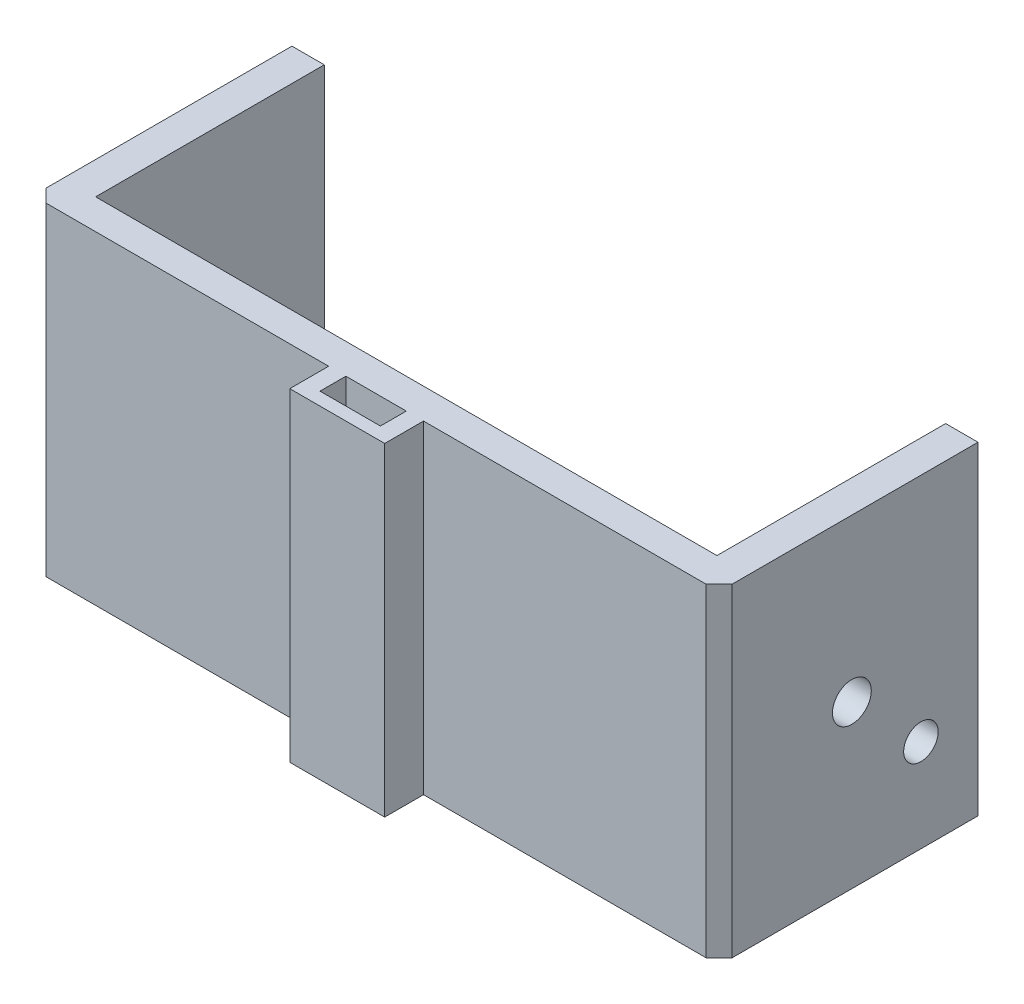
ISO-10303-21;
HEADER;
FILE_DESCRIPTION(('STEP AP214'),'2;1');
FILE_NAME('part.step','',(''),(''),'','','');
FILE_SCHEMA(('AUTOMOTIVE_DESIGN { 1 0 10303 214 1 1 1 1 }'));
ENDSEC;
DATA;
#1=APPLICATION_CONTEXT('core data for automotive mechanical design processes');
#2=APPLICATION_PROTOCOL_DEFINITION('international standard','automotive_design',2000,#1);
#3=PRODUCT_CONTEXT('',#1,'mechanical');
#4=PRODUCT('Part','Part','',(#3));
#5=PRODUCT_RELATED_PRODUCT_CATEGORY('part','',(#4));
#6=PRODUCT_DEFINITION_FORMATION('','',#4);
#7=PRODUCT_DEFINITION_CONTEXT('part definition',#1,'design');
#8=PRODUCT_DEFINITION('design','',#6,#7);
#9=PRODUCT_DEFINITION_SHAPE('','',#8);
#10=(LENGTH_UNIT() NAMED_UNIT(*) SI_UNIT(.MILLI.,.METRE.));
#11=(NAMED_UNIT(*) PLANE_ANGLE_UNIT() SI_UNIT($,.RADIAN.));
#12=(NAMED_UNIT(*) SI_UNIT($,.STERADIAN.) SOLID_ANGLE_UNIT());
#13=UNCERTAINTY_MEASURE_WITH_UNIT(LENGTH_MEASURE(1.E-05),#10,'distance_accuracy_value','');
#14=(GEOMETRIC_REPRESENTATION_CONTEXT(3) GLOBAL_UNCERTAINTY_ASSIGNED_CONTEXT((#13)) GLOBAL_UNIT_ASSIGNED_CONTEXT((#10,
#11,#12)) REPRESENTATION_CONTEXT('',''));
#15=CARTESIAN_POINT('',(0.,0.,0.));
#16=DIRECTION('',(0.,0.,1.));
#17=DIRECTION('',(1.,0.,0.));
#18=AXIS2_PLACEMENT_3D('',#15,#16,#17);
#19=CARTESIAN_POINT('',(0.,75.,0.));
#20=DIRECTION('',(0.,1.,0.));
#21=DIRECTION('',(0.,0.,1.));
#22=AXIS2_PLACEMENT_3D('',#19,#20,#21);
#23=PLANE('',#22);
#24=DIRECTION('',(-1.,0.,0.));
#25=VECTOR('',#24,1.);
#26=CARTESIAN_POINT('',(-72.,75.,3.00000000000002));
#27=LINE('',#26,#25);
#28=CARTESIAN_POINT('',(72.,75.,3.));
#29=VERTEX_POINT('',#28);
#30=CARTESIAN_POINT('',(-72.,75.,3.00000000000002));
#31=VERTEX_POINT('',#30);
#32=EDGE_CURVE('E309',#29,#31,#27,.T.);
#33=ORIENTED_EDGE('',*,*,#32,.T.);
#34=DIRECTION('',(0.,0.,-1.));
#35=VECTOR('',#34,1.);
#36=CARTESIAN_POINT('',(-72.,75.,0.));
#37=LINE('',#36,#35);
#38=CARTESIAN_POINT('',(-72.,75.,-50.));
#39=VERTEX_POINT('',#38);
#40=EDGE_CURVE('E221',#31,#39,#37,.T.);
#41=ORIENTED_EDGE('',*,*,#40,.T.);
#42=DIRECTION('',(-1.,0.,0.));
#43=VECTOR('',#42,1.);
#44=CARTESIAN_POINT('',(-72.,75.,-50.));
#45=LINE('',#44,#43);
#46=CARTESIAN_POINT('',(-79.5,75.,-50.));
#47=VERTEX_POINT('',#46);
#48=EDGE_CURVE('E224',#39,#47,#45,.T.);
#49=ORIENTED_EDGE('',*,*,#48,.T.);
#50=DIRECTION('',(0.,0.,1.));
#51=VECTOR('',#50,1.);
#52=CARTESIAN_POINT('',(-79.5,75.,-50.));
#53=LINE('',#52,#51);
#54=CARTESIAN_POINT('',(-79.5,75.,6.99999999999998));
#55=VERTEX_POINT('',#54);
#56=EDGE_CURVE('E227',#47,#55,#53,.T.);
#57=ORIENTED_EDGE('',*,*,#56,.T.);
#58=DIRECTION('',(-0.707106781186548,0.,-0.707106781186548));
#59=VECTOR('',#58,1.);
#60=CARTESIAN_POINT('',(-43.25,75.,43.25));
#61=LINE('',#60,#59);
#62=CARTESIAN_POINT('',(-76.4999999999999,75.,10.));
#63=VERTEX_POINT('',#62);
#64=EDGE_CURVE('E307',#55,#63,#61,.F.);
#65=ORIENTED_EDGE('',*,*,#64,.T.);
#66=DIRECTION('',(1.,0.,0.));
#67=VECTOR('',#66,1.);
#68=CARTESIAN_POINT('',(-11.,75.,10.));
#69=LINE('',#68,#67);
#70=CARTESIAN_POINT('',(-11.,75.,10.));
#71=VERTEX_POINT('',#70);
#72=EDGE_CURVE('E230',#63,#71,#69,.T.);
#73=ORIENTED_EDGE('',*,*,#72,.T.);
#74=DIRECTION('',(0.,0.,1.));
#75=VECTOR('',#74,1.);
#76=CARTESIAN_POINT('',(-11.,75.,10.));
#77=LINE('',#76,#75);
#78=CARTESIAN_POINT('',(-11.,75.,19.));
#79=VERTEX_POINT('',#78);
#80=EDGE_CURVE('E232',#71,#79,#77,.T.);
#81=ORIENTED_EDGE('',*,*,#80,.T.);
#82=DIRECTION('',(1.,0.,0.));
#83=VECTOR('',#82,1.);
#84=CARTESIAN_POINT('',(11.,75.,19.));
#85=LINE('',#84,#83);
#86=CARTESIAN_POINT('',(11.,75.,19.));
#87=VERTEX_POINT('',#86);
#88=EDGE_CURVE('E234',#79,#87,#85,.T.);
#89=ORIENTED_EDGE('',*,*,#88,.T.);
#90=DIRECTION('',(0.,0.,-1.));
#91=VECTOR('',#90,1.);
#92=CARTESIAN_POINT('',(11.,75.,10.));
#93=LINE('',#92,#91);
#94=CARTESIAN_POINT('',(11.,75.,10.));
#95=VERTEX_POINT('',#94);
#96=EDGE_CURVE('E236',#87,#95,#93,.T.);
#97=ORIENTED_EDGE('',*,*,#96,.T.);
#98=DIRECTION('',(1.,0.,0.));
#99=VECTOR('',#98,1.);
#100=CARTESIAN_POINT('',(79.5,75.,10.));
#101=LINE('',#100,#99);
#102=CARTESIAN_POINT('',(76.5,75.,10.));
#103=VERTEX_POINT('',#102);
#104=EDGE_CURVE('E238',#95,#103,#101,.T.);
#105=ORIENTED_EDGE('',*,*,#104,.T.);
#106=DIRECTION('',(-0.707106781186547,0.,0.707106781186548));
#107=VECTOR('',#106,1.);
#108=CARTESIAN_POINT('',(43.25,75.,43.25));
#109=LINE('',#108,#107);
#110=CARTESIAN_POINT('',(79.5,75.,6.99999999999999));
#111=VERTEX_POINT('',#110);
#112=EDGE_CURVE('E300',#103,#111,#109,.F.);
#113=ORIENTED_EDGE('',*,*,#112,.T.);
#114=DIRECTION('',(0.,0.,-1.));
#115=VECTOR('',#114,1.);
#116=CARTESIAN_POINT('',(79.5,75.,-50.));
#117=LINE('',#116,#115);
#118=CARTESIAN_POINT('',(79.5,75.,-50.));
#119=VERTEX_POINT('',#118);
#120=EDGE_CURVE('E241',#111,#119,#117,.T.);
#121=ORIENTED_EDGE('',*,*,#120,.T.);
#122=DIRECTION('',(-1.,0.,0.));
#123=VECTOR('',#122,1.);
#124=CARTESIAN_POINT('',(72.,75.,-50.));
#125=LINE('',#124,#123);
#126=CARTESIAN_POINT('',(72.,75.,-50.));
#127=VERTEX_POINT('',#126);
#128=EDGE_CURVE('E243',#119,#127,#125,.T.);
#129=ORIENTED_EDGE('',*,*,#128,.T.);
#130=DIRECTION('',(0.,0.,1.));
#131=VECTOR('',#130,1.);
#132=CARTESIAN_POINT('',(72.,75.,0.));
#133=LINE('',#132,#131);
#134=EDGE_CURVE('E245',#127,#29,#133,.T.);
#135=ORIENTED_EDGE('',*,*,#134,.T.);
#136=EDGE_LOOP('',(#33,#41,#49,#57,#65,#73,#81,#89,#97,#105,#113,#121,#129,#135));
#137=FACE_BOUND('',#136,.T.);
#138=DIRECTION('',(0.,0.,1.));
#139=VECTOR('',#138,1.);
#140=CARTESIAN_POINT('',(-7.,75.,10.));
#141=LINE('',#140,#139);
#142=CARTESIAN_POINT('',(-7.,75.,10.));
#143=VERTEX_POINT('',#142);
#144=CARTESIAN_POINT('',(-7.,75.,16.));
#145=VERTEX_POINT('',#144);
#146=EDGE_CURVE('E188',#143,#145,#141,.T.);
#147=ORIENTED_EDGE('',*,*,#146,.F.);
#148=DIRECTION('',(-1.,0.,0.));
#149=VECTOR('',#148,1.);
#150=CARTESIAN_POINT('',(7.,75.,10.));
#151=LINE('',#150,#149);
#152=CARTESIAN_POINT('',(7.,75.,10.));
#153=VERTEX_POINT('',#152);
#154=EDGE_CURVE('E178',#153,#143,#151,.T.);
#155=ORIENTED_EDGE('',*,*,#154,.F.);
#156=DIRECTION('',(0.,0.,-1.));
#157=VECTOR('',#156,1.);
#158=CARTESIAN_POINT('',(7.,75.,10.));
#159=LINE('',#158,#157);
#160=CARTESIAN_POINT('',(7.,75.,16.));
#161=VERTEX_POINT('',#160);
#162=EDGE_CURVE('E203',#161,#153,#159,.T.);
#163=ORIENTED_EDGE('',*,*,#162,.F.);
#164=DIRECTION('',(1.,0.,0.));
#165=VECTOR('',#164,1.);
#166=CARTESIAN_POINT('',(7.,75.,16.));
#167=LINE('',#166,#165);
#168=EDGE_CURVE('E201',#145,#161,#167,.T.);
#169=ORIENTED_EDGE('',*,*,#168,.F.);
#170=EDGE_LOOP('',(#147,#155,#163,#169));
#171=FACE_BOUND('',#170,.T.);
#172=ADVANCED_FACE('F43',(#137,#171),#23,.T.);
#173=CARTESIAN_POINT('',(0.,0.,0.));
#174=DIRECTION('',(0.,1.,0.));
#175=DIRECTION('',(0.,0.,1.));
#176=AXIS2_PLACEMENT_3D('',#173,#174,#175);
#177=PLANE('',#176);
#178=DIRECTION('',(1.,0.,0.));
#179=VECTOR('',#178,1.);
#180=CARTESIAN_POINT('',(-11.,0.,10.));
#181=LINE('',#180,#179);
#182=CARTESIAN_POINT('',(-76.4999999999999,0.,10.));
#183=VERTEX_POINT('',#182);
#184=CARTESIAN_POINT('',(-11.,0.,10.));
#185=VERTEX_POINT('',#184);
#186=EDGE_CURVE('E254',#183,#185,#181,.T.);
#187=ORIENTED_EDGE('',*,*,#186,.F.);
#188=DIRECTION('',(0.707106781186548,0.,0.707106781186548));
#189=VECTOR('',#188,1.);
#190=CARTESIAN_POINT('',(-76.4999999999999,0.,10.));
#191=LINE('',#190,#189);
#192=CARTESIAN_POINT('',(-79.5,0.,6.99999999999998));
#193=VERTEX_POINT('',#192);
#194=EDGE_CURVE('E60',#183,#193,#191,.F.);
#195=ORIENTED_EDGE('',*,*,#194,.T.);
#196=DIRECTION('',(0.,0.,1.));
#197=VECTOR('',#196,1.);
#198=CARTESIAN_POINT('',(-79.5,0.,-50.));
#199=LINE('',#198,#197);
#200=CARTESIAN_POINT('',(-79.5,0.,-50.));
#201=VERTEX_POINT('',#200);
#202=EDGE_CURVE('E252',#201,#193,#199,.T.);
#203=ORIENTED_EDGE('',*,*,#202,.F.);
#204=DIRECTION('',(-1.,0.,0.));
#205=VECTOR('',#204,1.);
#206=CARTESIAN_POINT('',(-72.,0.,-50.));
#207=LINE('',#206,#205);
#208=CARTESIAN_POINT('',(-72.,0.,-50.));
#209=VERTEX_POINT('',#208);
#210=EDGE_CURVE('E250',#209,#201,#207,.T.);
#211=ORIENTED_EDGE('',*,*,#210,.F.);
#212=DIRECTION('',(0.,0.,-1.));
#213=VECTOR('',#212,1.);
#214=CARTESIAN_POINT('',(-72.,0.,0.));
#215=LINE('',#214,#213);
#216=CARTESIAN_POINT('',(-72.,0.,0.));
#217=VERTEX_POINT('',#216);
#218=EDGE_CURVE('E196',#217,#209,#215,.T.);
#219=ORIENTED_EDGE('',*,*,#218,.F.);
#220=DIRECTION('',(-1.,0.,0.));
#221=VECTOR('',#220,1.);
#222=CARTESIAN_POINT('',(72.,0.,0.));
#223=LINE('',#222,#221);
#224=CARTESIAN_POINT('',(72.,0.,0.));
#225=VERTEX_POINT('',#224);
#226=EDGE_CURVE('E225',#225,#217,#223,.T.);
#227=ORIENTED_EDGE('',*,*,#226,.F.);
#228=DIRECTION('',(0.,0.,1.));
#229=VECTOR('',#228,1.);
#230=CARTESIAN_POINT('',(72.,0.,0.));
#231=LINE('',#230,#229);
#232=CARTESIAN_POINT('',(72.,0.,-50.));
#233=VERTEX_POINT('',#232);
#234=EDGE_CURVE('E268',#233,#225,#231,.T.);
#235=ORIENTED_EDGE('',*,*,#234,.F.);
#236=DIRECTION('',(-1.,0.,0.));
#237=VECTOR('',#236,1.);
#238=CARTESIAN_POINT('',(72.,0.,-50.));
#239=LINE('',#238,#237);
#240=CARTESIAN_POINT('',(79.5,0.,-50.));
#241=VERTEX_POINT('',#240);
#242=EDGE_CURVE('E266',#241,#233,#239,.T.);
#243=ORIENTED_EDGE('',*,*,#242,.F.);
#244=DIRECTION('',(0.,0.,-1.));
#245=VECTOR('',#244,1.);
#246=CARTESIAN_POINT('',(79.5,0.,-50.));
#247=LINE('',#246,#245);
#248=CARTESIAN_POINT('',(79.5,0.,6.99999999999999));
#249=VERTEX_POINT('',#248);
#250=EDGE_CURVE('E264',#249,#241,#247,.T.);
#251=ORIENTED_EDGE('',*,*,#250,.F.);
#252=DIRECTION('',(0.707106781186547,0.,-0.707106781186548));
#253=VECTOR('',#252,1.);
#254=CARTESIAN_POINT('',(79.5,0.,7.));
#255=LINE('',#254,#253);
#256=CARTESIAN_POINT('',(76.5,0.,10.));
#257=VERTEX_POINT('',#256);
#258=EDGE_CURVE('E67',#249,#257,#255,.F.);
#259=ORIENTED_EDGE('',*,*,#258,.T.);
#260=DIRECTION('',(1.,0.,0.));
#261=VECTOR('',#260,1.);
#262=CARTESIAN_POINT('',(79.5,0.,10.));
#263=LINE('',#262,#261);
#264=CARTESIAN_POINT('',(11.,0.,10.));
#265=VERTEX_POINT('',#264);
#266=EDGE_CURVE('E262',#265,#257,#263,.T.);
#267=ORIENTED_EDGE('',*,*,#266,.F.);
#268=DIRECTION('',(0.,0.,-1.));
#269=VECTOR('',#268,1.);
#270=CARTESIAN_POINT('',(11.,0.,10.));
#271=LINE('',#270,#269);
#272=CARTESIAN_POINT('',(11.,0.,19.));
#273=VERTEX_POINT('',#272);
#274=EDGE_CURVE('E260',#273,#265,#271,.T.);
#275=ORIENTED_EDGE('',*,*,#274,.F.);
#276=DIRECTION('',(1.,0.,0.));
#277=VECTOR('',#276,1.);
#278=CARTESIAN_POINT('',(11.,0.,19.));
#279=LINE('',#278,#277);
#280=CARTESIAN_POINT('',(-11.,0.,19.));
#281=VERTEX_POINT('',#280);
#282=EDGE_CURVE('E258',#281,#273,#279,.T.);
#283=ORIENTED_EDGE('',*,*,#282,.F.);
#284=DIRECTION('',(0.,0.,1.));
#285=VECTOR('',#284,1.);
#286=CARTESIAN_POINT('',(-11.,0.,10.));
#287=LINE('',#286,#285);
#288=EDGE_CURVE('E256',#185,#281,#287,.T.);
#289=ORIENTED_EDGE('',*,*,#288,.F.);
#290=EDGE_LOOP('',(#187,#195,#203,#211,#219,#227,#235,#243,#251,#259,#267,#275,#283,#289));
#291=FACE_BOUND('',#290,.T.);
#292=DIRECTION('',(-1.,0.,0.));
#293=VECTOR('',#292,1.);
#294=CARTESIAN_POINT('',(7.,0.,10.));
#295=LINE('',#294,#293);
#296=CARTESIAN_POINT('',(7.,0.,10.));
#297=VERTEX_POINT('',#296);
#298=CARTESIAN_POINT('',(-7.,0.,10.));
#299=VERTEX_POINT('',#298);
#300=EDGE_CURVE('E208',#297,#299,#295,.T.);
#301=ORIENTED_EDGE('',*,*,#300,.T.);
#302=DIRECTION('',(0.,0.,1.));
#303=VECTOR('',#302,1.);
#304=CARTESIAN_POINT('',(-7.,0.,10.));
#305=LINE('',#304,#303);
#306=CARTESIAN_POINT('',(-7.,0.,16.));
#307=VERTEX_POINT('',#306);
#308=EDGE_CURVE('E195',#299,#307,#305,.T.);
#309=ORIENTED_EDGE('',*,*,#308,.T.);
#310=DIRECTION('',(1.,0.,0.));
#311=VECTOR('',#310,1.);
#312=CARTESIAN_POINT('',(7.,0.,16.));
#313=LINE('',#312,#311);
#314=CARTESIAN_POINT('',(7.,0.,16.));
#315=VERTEX_POINT('',#314);
#316=EDGE_CURVE('E212',#307,#315,#313,.T.);
#317=ORIENTED_EDGE('',*,*,#316,.T.);
#318=DIRECTION('',(0.,0.,-1.));
#319=VECTOR('',#318,1.);
#320=CARTESIAN_POINT('',(7.,0.,10.));
#321=LINE('',#320,#319);
#322=EDGE_CURVE('E189',#315,#297,#321,.T.);
#323=ORIENTED_EDGE('',*,*,#322,.T.);
#324=EDGE_LOOP('',(#301,#309,#317,#323));
#325=FACE_BOUND('',#324,.T.);
#326=ADVANCED_FACE('F347',(#291,#325),#177,.F.);
#327=CARTESIAN_POINT('',(-72.,75.,0.));
#328=DIRECTION('',(-1.,0.,0.));
#329=DIRECTION('',(0.,0.,1.));
#330=AXIS2_PLACEMENT_3D('',#327,#328,#329);
#331=PLANE('',#330);
#332=CARTESIAN_POINT('',(-72.,21.5,-36.7700000000001));
#333=DIRECTION('',(-1.,0.,0.));
#334=DIRECTION('',(0.,0.,1.));
#335=AXIS2_PLACEMENT_3D('',#332,#333,#334);
#336=CIRCLE('',#335,4.00000000000001);
#337=CARTESIAN_POINT('',(-72.,21.5,-32.7700000000001));
#338=VERTEX_POINT('',#337);
#339=EDGE_CURVE('E584',#338,#338,#336,.T.);
#340=ORIENTED_EDGE('',*,*,#339,.T.);
#341=EDGE_LOOP('',(#340));
#342=FACE_BOUND('',#341,.T.);
#343=CARTESIAN_POINT('',(-72.,37.5,-20.77));
#344=DIRECTION('',(-1.,0.,0.));
#345=DIRECTION('',(0.,0.,1.));
#346=AXIS2_PLACEMENT_3D('',#343,#344,#345);
#347=CIRCLE('',#346,4.5);
#348=CARTESIAN_POINT('',(-72.,37.5,-16.27));
#349=VERTEX_POINT('',#348);
#350=EDGE_CURVE('E304',#349,#349,#347,.T.);
#351=ORIENTED_EDGE('',*,*,#350,.T.);
#352=EDGE_LOOP('',(#351));
#353=FACE_BOUND('',#352,.T.);
#354=ORIENTED_EDGE('',*,*,#218,.T.);
#355=DIRECTION('',(0.,-1.,0.));
#356=VECTOR('',#355,1.);
#357=CARTESIAN_POINT('',(-72.,75.,-50.));
#358=LINE('',#357,#356);
#359=EDGE_CURVE('E297',#39,#209,#358,.T.);
#360=ORIENTED_EDGE('',*,*,#359,.F.);
#361=ORIENTED_EDGE('',*,*,#40,.F.);
#362=DIRECTION('',(0.,-0.707106781186548,-0.707106781186548));
#363=VECTOR('',#362,1.);
#364=CARTESIAN_POINT('',(-72.,73.5,1.50000000000002));
#365=LINE('',#364,#363);
#366=CARTESIAN_POINT('',(-72.,72.,0.));
#367=VERTEX_POINT('',#366);
#368=EDGE_CURVE('E53',#31,#367,#365,.T.);
#369=ORIENTED_EDGE('',*,*,#368,.T.);
#370=DIRECTION('',(0.,-1.,0.));
#371=VECTOR('',#370,1.);
#372=CARTESIAN_POINT('',(-72.,75.,0.));
#373=LINE('',#372,#371);
#374=EDGE_CURVE('E247',#367,#217,#373,.T.);
#375=ORIENTED_EDGE('',*,*,#374,.T.);
#376=EDGE_LOOP('',(#354,#360,#361,#369,#375));
#377=FACE_BOUND('',#376,.T.);
#378=ADVANCED_FACE('F329',(#342,#353,#377),#331,.F.);
#379=CARTESIAN_POINT('',(-72.,75.,-50.));
#380=DIRECTION('',(0.,0.,1.));
#381=DIRECTION('',(1.,0.,0.));
#382=AXIS2_PLACEMENT_3D('',#379,#380,#381);
#383=PLANE('',#382);
#384=ORIENTED_EDGE('',*,*,#210,.T.);
#385=DIRECTION('',(0.,-1.,0.));
#386=VECTOR('',#385,1.);
#387=CARTESIAN_POINT('',(-79.5,75.,-50.));
#388=LINE('',#387,#386);
#389=EDGE_CURVE('E294',#47,#201,#388,.T.);
#390=ORIENTED_EDGE('',*,*,#389,.F.);
#391=ORIENTED_EDGE('',*,*,#48,.F.);
#392=ORIENTED_EDGE('',*,*,#359,.T.);
#393=EDGE_LOOP('',(#384,#390,#391,#392));
#394=FACE_BOUND('',#393,.T.);
#395=ADVANCED_FACE('F350',(#394),#383,.F.);
#396=CARTESIAN_POINT('',(-79.5,75.,-50.));
#397=DIRECTION('',(1.,0.,0.));
#398=DIRECTION('',(0.,0.,-1.));
#399=AXIS2_PLACEMENT_3D('',#396,#397,#398);
#400=PLANE('',#399);
#401=CARTESIAN_POINT('',(-79.5,21.5,-36.7700000000001));
#402=DIRECTION('',(1.,0.,0.));
#403=DIRECTION('',(0.,0.,-1.));
#404=AXIS2_PLACEMENT_3D('',#401,#402,#403);
#405=CIRCLE('',#404,4.00000000000001);
#406=CARTESIAN_POINT('',(-79.5,21.5,-40.7700000000001));
#407=VERTEX_POINT('',#406);
#408=EDGE_CURVE('E581',#407,#407,#405,.T.);
#409=ORIENTED_EDGE('',*,*,#408,.T.);
#410=EDGE_LOOP('',(#409));
#411=FACE_BOUND('',#410,.T.);
#412=CARTESIAN_POINT('',(-79.5,37.5,-20.77));
#413=DIRECTION('',(1.,0.,0.));
#414=DIRECTION('',(0.,0.,-1.));
#415=AXIS2_PLACEMENT_3D('',#412,#413,#414);
#416=CIRCLE('',#415,4.5);
#417=CARTESIAN_POINT('',(-79.5,37.5,-25.27));
#418=VERTEX_POINT('',#417);
#419=EDGE_CURVE('E305',#418,#418,#416,.T.);
#420=ORIENTED_EDGE('',*,*,#419,.T.);
#421=EDGE_LOOP('',(#420));
#422=FACE_BOUND('',#421,.T.);
#423=ORIENTED_EDGE('',*,*,#202,.T.);
#424=DIRECTION('',(0.,1.,0.));
#425=VECTOR('',#424,1.);
#426=CARTESIAN_POINT('',(-79.5,75.,6.99999999999999));
#427=LINE('',#426,#425);
#428=EDGE_CURVE('E319',#193,#55,#427,.T.);
#429=ORIENTED_EDGE('',*,*,#428,.T.);
#430=ORIENTED_EDGE('',*,*,#56,.F.);
#431=ORIENTED_EDGE('',*,*,#389,.T.);
#432=EDGE_LOOP('',(#423,#429,#430,#431));
#433=FACE_BOUND('',#432,.T.);
#434=ADVANCED_FACE('F393',(#411,#422,#433),#400,.F.);
#435=CARTESIAN_POINT('',(-11.,75.,10.));
#436=DIRECTION('',(0.,0.,-1.));
#437=DIRECTION('',(-1.,0.,0.));
#438=AXIS2_PLACEMENT_3D('',#435,#436,#437);
#439=PLANE('',#438);
#440=ORIENTED_EDGE('',*,*,#72,.F.);
#441=DIRECTION('',(0.,-1.,0.));
#442=VECTOR('',#441,1.);
#443=CARTESIAN_POINT('',(-76.4999999999999,75.,10.));
#444=LINE('',#443,#442);
#445=EDGE_CURVE('E314',#63,#183,#444,.T.);
#446=ORIENTED_EDGE('',*,*,#445,.T.);
#447=ORIENTED_EDGE('',*,*,#186,.T.);
#448=DIRECTION('',(0.,-1.,0.));
#449=VECTOR('',#448,1.);
#450=CARTESIAN_POINT('',(-11.,75.,10.));
#451=LINE('',#450,#449);
#452=EDGE_CURVE('E291',#71,#185,#451,.T.);
#453=ORIENTED_EDGE('',*,*,#452,.F.);
#454=EDGE_LOOP('',(#440,#446,#447,#453));
#455=FACE_BOUND('',#454,.T.);
#456=ADVANCED_FACE('F386',(#455),#439,.F.);
#457=CARTESIAN_POINT('',(-11.,75.,10.));
#458=DIRECTION('',(1.,0.,0.));
#459=DIRECTION('',(0.,0.,-1.));
#460=AXIS2_PLACEMENT_3D('',#457,#458,#459);
#461=PLANE('',#460);
#462=ORIENTED_EDGE('',*,*,#288,.T.);
#463=DIRECTION('',(0.,-1.,0.));
#464=VECTOR('',#463,1.);
#465=CARTESIAN_POINT('',(-11.,75.,19.));
#466=LINE('',#465,#464);
#467=EDGE_CURVE('E288',#79,#281,#466,.T.);
#468=ORIENTED_EDGE('',*,*,#467,.F.);
#469=ORIENTED_EDGE('',*,*,#80,.F.);
#470=ORIENTED_EDGE('',*,*,#452,.T.);
#471=EDGE_LOOP('',(#462,#468,#469,#470));
#472=FACE_BOUND('',#471,.T.);
#473=ADVANCED_FACE('F382',(#472),#461,.F.);
#474=CARTESIAN_POINT('',(11.,75.,19.));
#475=DIRECTION('',(0.,0.,-1.));
#476=DIRECTION('',(-1.,0.,0.));
#477=AXIS2_PLACEMENT_3D('',#474,#475,#476);
#478=PLANE('',#477);
#479=ORIENTED_EDGE('',*,*,#282,.T.);
#480=DIRECTION('',(0.,-1.,0.));
#481=VECTOR('',#480,1.);
#482=CARTESIAN_POINT('',(11.,75.,19.));
#483=LINE('',#482,#481);
#484=EDGE_CURVE('E285',#87,#273,#483,.T.);
#485=ORIENTED_EDGE('',*,*,#484,.F.);
#486=ORIENTED_EDGE('',*,*,#88,.F.);
#487=ORIENTED_EDGE('',*,*,#467,.T.);
#488=EDGE_LOOP('',(#479,#485,#486,#487));
#489=FACE_BOUND('',#488,.T.);
#490=ADVANCED_FACE('F378',(#489),#478,.F.);
#491=CARTESIAN_POINT('',(11.,75.,10.));
#492=DIRECTION('',(-1.,0.,0.));
#493=DIRECTION('',(0.,0.,1.));
#494=AXIS2_PLACEMENT_3D('',#491,#492,#493);
#495=PLANE('',#494);
#496=ORIENTED_EDGE('',*,*,#274,.T.);
#497=DIRECTION('',(0.,-1.,0.));
#498=VECTOR('',#497,1.);
#499=CARTESIAN_POINT('',(11.,75.,10.));
#500=LINE('',#499,#498);
#501=EDGE_CURVE('E282',#95,#265,#500,.T.);
#502=ORIENTED_EDGE('',*,*,#501,.F.);
#503=ORIENTED_EDGE('',*,*,#96,.F.);
#504=ORIENTED_EDGE('',*,*,#484,.T.);
#505=EDGE_LOOP('',(#496,#502,#503,#504));
#506=FACE_BOUND('',#505,.T.);
#507=ADVANCED_FACE('F373',(#506),#495,.F.);
#508=CARTESIAN_POINT('',(79.5,75.,10.));
#509=DIRECTION('',(0.,0.,-1.));
#510=DIRECTION('',(-1.,0.,0.));
#511=AXIS2_PLACEMENT_3D('',#508,#509,#510);
#512=PLANE('',#511);
#513=ORIENTED_EDGE('',*,*,#266,.T.);
#514=DIRECTION('',(0.,1.,0.));
#515=VECTOR('',#514,1.);
#516=CARTESIAN_POINT('',(76.5,75.,10.));
#517=LINE('',#516,#515);
#518=EDGE_CURVE('E324',#257,#103,#517,.T.);
#519=ORIENTED_EDGE('',*,*,#518,.T.);
#520=ORIENTED_EDGE('',*,*,#104,.F.);
#521=ORIENTED_EDGE('',*,*,#501,.T.);
#522=EDGE_LOOP('',(#513,#519,#520,#521));
#523=FACE_BOUND('',#522,.T.);
#524=ADVANCED_FACE('F367',(#523),#512,.F.);
#525=CARTESIAN_POINT('',(79.5,75.,-50.));
#526=DIRECTION('',(-1.,0.,0.));
#527=DIRECTION('',(0.,0.,1.));
#528=AXIS2_PLACEMENT_3D('',#525,#526,#527);
#529=PLANE('',#528);
#530=CARTESIAN_POINT('',(79.5,21.5,-36.7700000000001));
#531=DIRECTION('',(1.,0.,0.));
#532=DIRECTION('',(0.,0.,-1.));
#533=AXIS2_PLACEMENT_3D('',#530,#531,#532);
#534=CIRCLE('',#533,4.00000000000001);
#535=CARTESIAN_POINT('',(79.5,21.5,-40.7700000000001));
#536=VERTEX_POINT('',#535);
#537=EDGE_CURVE('E592',#536,#536,#534,.T.);
#538=ORIENTED_EDGE('',*,*,#537,.F.);
#539=EDGE_LOOP('',(#538));
#540=FACE_BOUND('',#539,.T.);
#541=CARTESIAN_POINT('',(79.5,37.5,-20.77));
#542=DIRECTION('',(1.,0.,0.));
#543=DIRECTION('',(0.,0.,-1.));
#544=AXIS2_PLACEMENT_3D('',#541,#542,#543);
#545=CIRCLE('',#544,4.5);
#546=CARTESIAN_POINT('',(79.5,37.5,-25.27));
#547=VERTEX_POINT('',#546);
#548=EDGE_CURVE('E586',#547,#547,#545,.T.);
#549=ORIENTED_EDGE('',*,*,#548,.F.);
#550=EDGE_LOOP('',(#549));
#551=FACE_BOUND('',#550,.T.);
#552=ORIENTED_EDGE('',*,*,#120,.F.);
#553=DIRECTION('',(0.,-1.,0.));
#554=VECTOR('',#553,1.);
#555=CARTESIAN_POINT('',(79.5,75.,7.));
#556=LINE('',#555,#554);
#557=EDGE_CURVE('E321',#111,#249,#556,.T.);
#558=ORIENTED_EDGE('',*,*,#557,.T.);
#559=ORIENTED_EDGE('',*,*,#250,.T.);
#560=DIRECTION('',(0.,-1.,0.));
#561=VECTOR('',#560,1.);
#562=CARTESIAN_POINT('',(79.5,75.,-50.));
#563=LINE('',#562,#561);
#564=EDGE_CURVE('E279',#119,#241,#563,.T.);
#565=ORIENTED_EDGE('',*,*,#564,.F.);
#566=EDGE_LOOP('',(#552,#558,#559,#565));
#567=FACE_BOUND('',#566,.T.);
#568=ADVANCED_FACE('F360',(#540,#551,#567),#529,.F.);
#569=CARTESIAN_POINT('',(72.,75.,-50.));
#570=DIRECTION('',(0.,0.,1.));
#571=DIRECTION('',(1.,0.,0.));
#572=AXIS2_PLACEMENT_3D('',#569,#570,#571);
#573=PLANE('',#572);
#574=ORIENTED_EDGE('',*,*,#242,.T.);
#575=DIRECTION('',(0.,-1.,0.));
#576=VECTOR('',#575,1.);
#577=CARTESIAN_POINT('',(72.,75.,-50.));
#578=LINE('',#577,#576);
#579=EDGE_CURVE('E276',#127,#233,#578,.T.);
#580=ORIENTED_EDGE('',*,*,#579,.F.);
#581=ORIENTED_EDGE('',*,*,#128,.F.);
#582=ORIENTED_EDGE('',*,*,#564,.T.);
#583=EDGE_LOOP('',(#574,#580,#581,#582));
#584=FACE_BOUND('',#583,.T.);
#585=ADVANCED_FACE('F358',(#584),#573,.F.);
#586=CARTESIAN_POINT('',(72.,75.,0.));
#587=DIRECTION('',(1.,0.,0.));
#588=DIRECTION('',(0.,0.,-1.));
#589=AXIS2_PLACEMENT_3D('',#586,#587,#588);
#590=PLANE('',#589);
#591=CARTESIAN_POINT('',(72.,21.5,-36.7700000000001));
#592=DIRECTION('',(1.,0.,0.));
#593=DIRECTION('',(0.,0.,-1.));
#594=AXIS2_PLACEMENT_3D('',#591,#592,#593);
#595=CIRCLE('',#594,4.00000000000001);
#596=CARTESIAN_POINT('',(72.,21.5,-40.7700000000001));
#597=VERTEX_POINT('',#596);
#598=EDGE_CURVE('E48',#597,#597,#595,.T.);
#599=ORIENTED_EDGE('',*,*,#598,.T.);
#600=EDGE_LOOP('',(#599));
#601=FACE_BOUND('',#600,.T.);
#602=CARTESIAN_POINT('',(72.,37.5,-20.77));
#603=DIRECTION('',(1.,0.,0.));
#604=DIRECTION('',(0.,0.,-1.));
#605=AXIS2_PLACEMENT_3D('',#602,#603,#604);
#606=CIRCLE('',#605,4.5);
#607=CARTESIAN_POINT('',(72.,37.5,-25.27));
#608=VERTEX_POINT('',#607);
#609=EDGE_CURVE('E301',#608,#608,#606,.T.);
#610=ORIENTED_EDGE('',*,*,#609,.T.);
#611=EDGE_LOOP('',(#610));
#612=FACE_BOUND('',#611,.T.);
#613=ORIENTED_EDGE('',*,*,#234,.T.);
#614=DIRECTION('',(0.,-1.,0.));
#615=VECTOR('',#614,1.);
#616=CARTESIAN_POINT('',(72.,75.,0.));
#617=LINE('',#616,#615);
#618=CARTESIAN_POINT('',(72.,72.,0.));
#619=VERTEX_POINT('',#618);
#620=EDGE_CURVE('E274',#619,#225,#617,.T.);
#621=ORIENTED_EDGE('',*,*,#620,.F.);
#622=DIRECTION('',(0.,0.707106781186548,0.707106781186548));
#623=VECTOR('',#622,1.);
#624=CARTESIAN_POINT('',(72.,73.5,1.5));
#625=LINE('',#624,#623);
#626=EDGE_CURVE('E11',#619,#29,#625,.T.);
#627=ORIENTED_EDGE('',*,*,#626,.T.);
#628=ORIENTED_EDGE('',*,*,#134,.F.);
#629=ORIENTED_EDGE('',*,*,#579,.T.);
#630=EDGE_LOOP('',(#613,#621,#627,#628,#629));
#631=FACE_BOUND('',#630,.T.);
#632=ADVANCED_FACE('F343',(#601,#612,#631),#590,.F.);
#633=CARTESIAN_POINT('',(72.,75.,0.));
#634=DIRECTION('',(0.,0.,1.));
#635=DIRECTION('',(1.,0.,0.));
#636=AXIS2_PLACEMENT_3D('',#633,#634,#635);
#637=PLANE('',#636);
#638=CARTESIAN_POINT('',(0.,37.5,0.));
#639=DIRECTION('',(0.,0.,-1.));
#640=DIRECTION('',(-1.,0.,0.));
#641=AXIS2_PLACEMENT_3D('',#638,#639,#640);
#642=CIRCLE('',#641,4.5);
#643=CARTESIAN_POINT('',(-4.5,37.5,0.));
#644=VERTEX_POINT('',#643);
#645=EDGE_CURVE('E599',#644,#644,#642,.T.);
#646=ORIENTED_EDGE('',*,*,#645,.F.);
#647=EDGE_LOOP('',(#646));
#648=FACE_BOUND('',#647,.T.);
#649=ORIENTED_EDGE('',*,*,#374,.F.);
#650=DIRECTION('',(1.,0.,0.));
#651=VECTOR('',#650,1.);
#652=CARTESIAN_POINT('',(72.,72.,0.));
#653=LINE('',#652,#651);
#654=EDGE_CURVE('E312',#367,#619,#653,.T.);
#655=ORIENTED_EDGE('',*,*,#654,.T.);
#656=ORIENTED_EDGE('',*,*,#620,.T.);
#657=ORIENTED_EDGE('',*,*,#226,.T.);
#658=EDGE_LOOP('',(#649,#655,#656,#657));
#659=FACE_BOUND('',#658,.T.);
#660=ADVANCED_FACE('F335',(#648,#659),#637,.F.);
#661=CARTESIAN_POINT('',(7.,75.,10.));
#662=DIRECTION('',(0.,0.,1.));
#663=DIRECTION('',(1.,0.,0.));
#664=AXIS2_PLACEMENT_3D('',#661,#662,#663);
#665=PLANE('',#664);
#666=CARTESIAN_POINT('',(0.,37.5,10.));
#667=DIRECTION('',(0.,0.,1.));
#668=DIRECTION('',(1.,0.,0.));
#669=AXIS2_PLACEMENT_3D('',#666,#667,#668);
#670=CIRCLE('',#669,4.5);
#671=CARTESIAN_POINT('',(4.5,37.5,10.));
#672=VERTEX_POINT('',#671);
#673=EDGE_CURVE('E210',#672,#672,#670,.T.);
#674=ORIENTED_EDGE('',*,*,#673,.F.);
#675=EDGE_LOOP('',(#674));
#676=FACE_BOUND('',#675,.T.);
#677=ORIENTED_EDGE('',*,*,#300,.F.);
#678=DIRECTION('',(0.,-1.,0.));
#679=VECTOR('',#678,1.);
#680=CARTESIAN_POINT('',(7.,75.,10.));
#681=LINE('',#680,#679);
#682=EDGE_CURVE('E184',#153,#297,#681,.T.);
#683=ORIENTED_EDGE('',*,*,#682,.F.);
#684=ORIENTED_EDGE('',*,*,#154,.T.);
#685=DIRECTION('',(0.,-1.,0.));
#686=VECTOR('',#685,1.);
#687=CARTESIAN_POINT('',(-7.,75.,10.));
#688=LINE('',#687,#686);
#689=EDGE_CURVE('E181',#143,#299,#688,.T.);
#690=ORIENTED_EDGE('',*,*,#689,.T.);
#691=EDGE_LOOP('',(#677,#683,#684,#690));
#692=FACE_BOUND('',#691,.T.);
#693=ADVANCED_FACE('F180',(#676,#692),#665,.T.);
#694=CARTESIAN_POINT('',(-7.,75.,10.));
#695=DIRECTION('',(1.,0.,0.));
#696=DIRECTION('',(0.,0.,-1.));
#697=AXIS2_PLACEMENT_3D('',#694,#695,#696);
#698=PLANE('',#697);
#699=ORIENTED_EDGE('',*,*,#308,.F.);
#700=ORIENTED_EDGE('',*,*,#689,.F.);
#701=ORIENTED_EDGE('',*,*,#146,.T.);
#702=DIRECTION('',(0.,-1.,0.));
#703=VECTOR('',#702,1.);
#704=CARTESIAN_POINT('',(-7.,75.,16.));
#705=LINE('',#704,#703);
#706=EDGE_CURVE('E197',#145,#307,#705,.T.);
#707=ORIENTED_EDGE('',*,*,#706,.T.);
#708=EDGE_LOOP('',(#699,#700,#701,#707));
#709=FACE_BOUND('',#708,.T.);
#710=ADVANCED_FACE('F192',(#709),#698,.T.);
#711=CARTESIAN_POINT('',(7.,75.,16.));
#712=DIRECTION('',(0.,0.,-1.));
#713=DIRECTION('',(-1.,0.,0.));
#714=AXIS2_PLACEMENT_3D('',#711,#712,#713);
#715=PLANE('',#714);
#716=ORIENTED_EDGE('',*,*,#316,.F.);
#717=ORIENTED_EDGE('',*,*,#706,.F.);
#718=ORIENTED_EDGE('',*,*,#168,.T.);
#719=DIRECTION('',(0.,-1.,0.));
#720=VECTOR('',#719,1.);
#721=CARTESIAN_POINT('',(7.,75.,16.));
#722=LINE('',#721,#720);
#723=EDGE_CURVE('E218',#161,#315,#722,.T.);
#724=ORIENTED_EDGE('',*,*,#723,.T.);
#725=EDGE_LOOP('',(#716,#717,#718,#724));
#726=FACE_BOUND('',#725,.T.);
#727=ADVANCED_FACE('F486',(#726),#715,.T.);
#728=CARTESIAN_POINT('',(7.,75.,10.));
#729=DIRECTION('',(-1.,0.,0.));
#730=DIRECTION('',(0.,0.,1.));
#731=AXIS2_PLACEMENT_3D('',#728,#729,#730);
#732=PLANE('',#731);
#733=ORIENTED_EDGE('',*,*,#322,.F.);
#734=ORIENTED_EDGE('',*,*,#723,.F.);
#735=ORIENTED_EDGE('',*,*,#162,.T.);
#736=ORIENTED_EDGE('',*,*,#682,.T.);
#737=EDGE_LOOP('',(#733,#734,#735,#736));
#738=FACE_BOUND('',#737,.T.);
#739=ADVANCED_FACE('F491',(#738),#732,.T.);
#740=CARTESIAN_POINT('',(0.,37.5,28.7279220613579));
#741=DIRECTION('',(0.,0.,-1.));
#742=DIRECTION('',(-1.,0.,0.));
#743=AXIS2_PLACEMENT_3D('',#740,#741,#742);
#744=CYLINDRICAL_SURFACE('',#743,4.5);
#745=ORIENTED_EDGE('',*,*,#673,.T.);
#746=EDGE_LOOP('',(#745));
#747=FACE_BOUND('',#746,.T.);
#748=ORIENTED_EDGE('',*,*,#645,.T.);
#749=EDGE_LOOP('',(#748));
#750=FACE_BOUND('',#749,.T.);
#751=ADVANCED_FACE('F499',(#747,#750),#744,.F.);
#752=CARTESIAN_POINT('',(-79.5,37.5,-20.77));
#753=DIRECTION('',(1.,0.,0.));
#754=DIRECTION('',(0.,0.,-1.));
#755=AXIS2_PLACEMENT_3D('',#752,#753,#754);
#756=CYLINDRICAL_SURFACE('',#755,4.5);
#757=ORIENTED_EDGE('',*,*,#548,.T.);
#758=EDGE_LOOP('',(#757));
#759=FACE_BOUND('',#758,.T.);
#760=ORIENTED_EDGE('',*,*,#609,.F.);
#761=EDGE_LOOP('',(#760));
#762=FACE_BOUND('',#761,.T.);
#763=ADVANCED_FACE('F506',(#759,#762),#756,.F.);
#764=ORIENTED_EDGE('',*,*,#419,.F.);
#765=EDGE_LOOP('',(#764));
#766=FACE_BOUND('',#765,.T.);
#767=ORIENTED_EDGE('',*,*,#350,.F.);
#768=EDGE_LOOP('',(#767));
#769=FACE_BOUND('',#768,.T.);
#770=ADVANCED_FACE('F514',(#766,#769),#756,.F.);
#771=CARTESIAN_POINT('',(0.,75.,3.00000000000001));
#772=DIRECTION('',(0.,0.707106781186547,-0.707106781186547));
#773=DIRECTION('',(1.,0.,0.));
#774=AXIS2_PLACEMENT_3D('',#771,#772,#773);
#775=PLANE('',#774);
#776=ORIENTED_EDGE('',*,*,#626,.F.);
#777=ORIENTED_EDGE('',*,*,#654,.F.);
#778=ORIENTED_EDGE('',*,*,#368,.F.);
#779=ORIENTED_EDGE('',*,*,#32,.F.);
#780=EDGE_LOOP('',(#776,#777,#778,#779));
#781=FACE_BOUND('',#780,.T.);
#782=ADVANCED_FACE('F340',(#781),#775,.T.);
#783=CARTESIAN_POINT('',(-76.4999999999999,75.,10.));
#784=DIRECTION('',(0.707106781186547,0.,-0.707106781186547));
#785=DIRECTION('',(0.,-1.,0.));
#786=AXIS2_PLACEMENT_3D('',#783,#784,#785);
#787=PLANE('',#786);
#788=ORIENTED_EDGE('',*,*,#64,.F.);
#789=ORIENTED_EDGE('',*,*,#428,.F.);
#790=ORIENTED_EDGE('',*,*,#194,.F.);
#791=ORIENTED_EDGE('',*,*,#445,.F.);
#792=EDGE_LOOP('',(#788,#789,#790,#791));
#793=FACE_BOUND('',#792,.T.);
#794=ADVANCED_FACE('F390',(#793),#787,.F.);
#795=CARTESIAN_POINT('',(79.5,75.,7.));
#796=DIRECTION('',(-0.707106781186548,0.,-0.707106781186547));
#797=DIRECTION('',(0.,-1.,0.));
#798=AXIS2_PLACEMENT_3D('',#795,#796,#797);
#799=PLANE('',#798);
#800=ORIENTED_EDGE('',*,*,#112,.F.);
#801=ORIENTED_EDGE('',*,*,#518,.F.);
#802=ORIENTED_EDGE('',*,*,#258,.F.);
#803=ORIENTED_EDGE('',*,*,#557,.F.);
#804=EDGE_LOOP('',(#800,#801,#802,#803));
#805=FACE_BOUND('',#804,.T.);
#806=ADVANCED_FACE('F46',(#805),#799,.F.);
#807=CARTESIAN_POINT('',(-79.5,21.5,-36.7700000000001));
#808=DIRECTION('',(1.,0.,0.));
#809=DIRECTION('',(0.,0.,-1.));
#810=AXIS2_PLACEMENT_3D('',#807,#808,#809);
#811=CYLINDRICAL_SURFACE('',#810,4.00000000000001);
#812=ORIENTED_EDGE('',*,*,#537,.T.);
#813=EDGE_LOOP('',(#812));
#814=FACE_BOUND('',#813,.T.);
#815=ORIENTED_EDGE('',*,*,#598,.F.);
#816=EDGE_LOOP('',(#815));
#817=FACE_BOUND('',#816,.T.);
#818=ADVANCED_FACE('F538',(#814,#817),#811,.F.);
#819=ORIENTED_EDGE('',*,*,#408,.F.);
#820=EDGE_LOOP('',(#819));
#821=FACE_BOUND('',#820,.T.);
#822=ORIENTED_EDGE('',*,*,#339,.F.);
#823=EDGE_LOOP('',(#822));
#824=FACE_BOUND('',#823,.T.);
#825=ADVANCED_FACE('F543',(#821,#824),#811,.F.);
#826=CLOSED_SHELL('',(#172,#326,#378,#395,#434,#456,#473,#490,#507,#524,#568,#585,#632,#660,
#693,#710,#727,#739,#751,#763,#770,#782,#794,#806,#818,#825));
#827=MANIFOLD_SOLID_BREP('B2',#826);
#828=ADVANCED_BREP_SHAPE_REPRESENTATION('',(#18,#827),#14);
#829=SHAPE_DEFINITION_REPRESENTATION(#9,#828);
ENDSEC;
END-ISO-10303-21;
